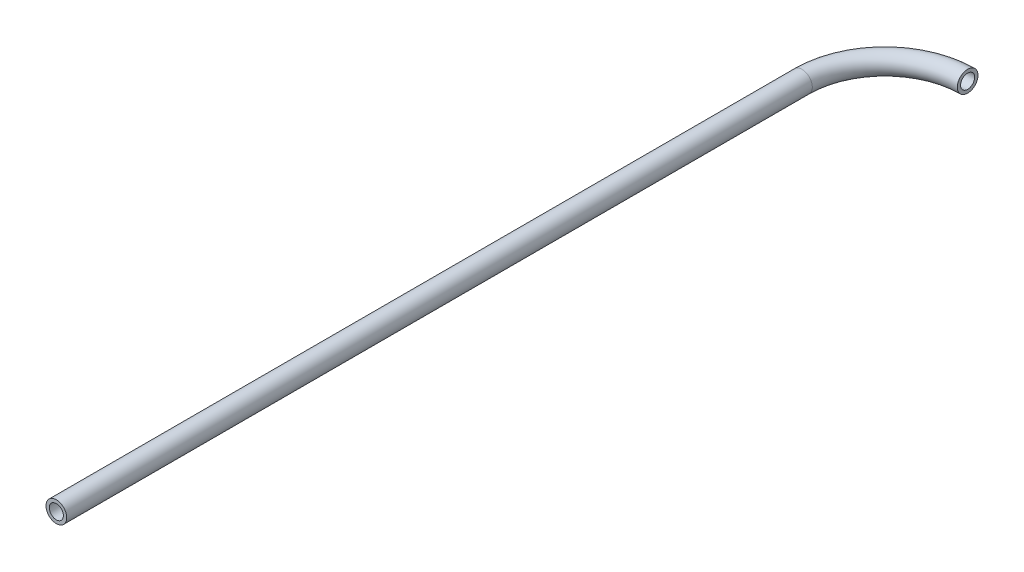
ISO-10303-21;
HEADER;
FILE_DESCRIPTION(('STEP AP214'),'2;1');
FILE_NAME('part.step','',(''),(''),'','','');
FILE_SCHEMA(('AUTOMOTIVE_DESIGN { 1 0 10303 214 1 1 1 1 }'));
ENDSEC;
DATA;
#1=APPLICATION_CONTEXT('core data for automotive mechanical design processes');
#2=APPLICATION_PROTOCOL_DEFINITION('international standard','automotive_design',2000,#1);
#3=PRODUCT_CONTEXT('',#1,'mechanical');
#4=PRODUCT('Part','Part','',(#3));
#5=PRODUCT_RELATED_PRODUCT_CATEGORY('part','',(#4));
#6=PRODUCT_DEFINITION_FORMATION('','',#4);
#7=PRODUCT_DEFINITION_CONTEXT('part definition',#1,'design');
#8=PRODUCT_DEFINITION('design','',#6,#7);
#9=PRODUCT_DEFINITION_SHAPE('','',#8);
#10=(LENGTH_UNIT() NAMED_UNIT(*) SI_UNIT(.MILLI.,.METRE.));
#11=(NAMED_UNIT(*) PLANE_ANGLE_UNIT() SI_UNIT($,.RADIAN.));
#12=(NAMED_UNIT(*) SI_UNIT($,.STERADIAN.) SOLID_ANGLE_UNIT());
#13=UNCERTAINTY_MEASURE_WITH_UNIT(LENGTH_MEASURE(1.E-05),#10,'distance_accuracy_value','');
#14=(GEOMETRIC_REPRESENTATION_CONTEXT(3) GLOBAL_UNCERTAINTY_ASSIGNED_CONTEXT((#13)) GLOBAL_UNIT_ASSIGNED_CONTEXT((#10,
#11,#12)) REPRESENTATION_CONTEXT('',''));
#15=CARTESIAN_POINT('',(0.,0.,0.));
#16=DIRECTION('',(0.,0.,1.));
#17=DIRECTION('',(1.,0.,0.));
#18=AXIS2_PLACEMENT_3D('',#15,#16,#17);
#19=CARTESIAN_POINT('',(-26.3429505447597,0.,-107.680105259806));
#20=DIRECTION('',(0.,-1.,0.));
#21=DIRECTION('',(0.,0.,-1.));
#22=AXIS2_PLACEMENT_3D('',#19,#20,#21);
#23=TOROIDAL_SURFACE('',#22,25.4,3.175);
#24=CARTESIAN_POINT('',(-51.7429505447597,0.,-107.680105259806));
#25=DIRECTION('',(0.,0.,1.));
#26=DIRECTION('',(1.,0.,0.));
#27=AXIS2_PLACEMENT_3D('',#24,#25,#26);
#28=CIRCLE('',#27,3.175);
#29=CARTESIAN_POINT('',(-54.9179505447597,0.,-107.680105259806));
#30=VERTEX_POINT('',#29);
#31=EDGE_CURVE('E41',#30,#30,#28,.T.);
#32=CARTESIAN_POINT('',(-26.3429505447596,0.,-133.080105259806));
#33=DIRECTION('',(-1.,0.,0.));
#34=DIRECTION('',(0.,0.,1.));
#35=AXIS2_PLACEMENT_3D('',#32,#33,#34);
#36=CIRCLE('',#35,3.175);
#37=CARTESIAN_POINT('',(-26.3429505447596,0.,-136.255105259806));
#38=VERTEX_POINT('',#37);
#39=EDGE_CURVE('E10',#38,#38,#36,.T.);
#40=CARTESIAN_POINT('',(-26.3429505447597,0.,-107.680105259806));
#41=DIRECTION('',(0.,-1.,0.));
#42=DIRECTION('',(0.,0.,-1.));
#43=AXIS2_PLACEMENT_3D('',#40,#41,#42);
#44=CIRCLE('',#43,28.575);
#45=EDGE_CURVE('',#30,#38,#44,.T.);
#46=ORIENTED_EDGE('',*,*,#31,.F.);
#47=ORIENTED_EDGE('',*,*,#39,.T.);
#48=ORIENTED_EDGE('',*,*,#45,.T.);
#49=ORIENTED_EDGE('',*,*,#45,.F.);
#50=EDGE_LOOP('',(#46,#48,#47,#49));
#51=FACE_BOUND('',#50,.T.);
#52=ADVANCED_FACE('F31',(#51),#23,.T.);
#53=CARTESIAN_POINT('',(-26.3429505447597,0.,-107.680105259806));
#54=DIRECTION('',(0.,-1.,0.));
#55=DIRECTION('',(0.,0.,-1.));
#56=AXIS2_PLACEMENT_3D('',#53,#54,#55);
#57=TOROIDAL_SURFACE('',#56,25.4,2.159);
#58=CARTESIAN_POINT('',(-51.7429505447597,0.,-107.680105259806));
#59=DIRECTION('',(0.,0.,1.));
#60=DIRECTION('',(1.,0.,0.));
#61=AXIS2_PLACEMENT_3D('',#58,#59,#60);
#62=CIRCLE('',#61,2.159);
#63=CARTESIAN_POINT('',(-53.9019505447597,0.,-107.680105259806));
#64=VERTEX_POINT('',#63);
#65=EDGE_CURVE('E45',#64,#64,#62,.T.);
#66=CARTESIAN_POINT('',(-26.3429505447596,0.,-133.080105259806));
#67=DIRECTION('',(-1.,0.,0.));
#68=DIRECTION('',(0.,0.,1.));
#69=AXIS2_PLACEMENT_3D('',#66,#67,#68);
#70=CIRCLE('',#69,2.159);
#71=CARTESIAN_POINT('',(-26.3429505447596,0.,-135.239105259806));
#72=VERTEX_POINT('',#71);
#73=EDGE_CURVE('E37',#72,#72,#70,.T.);
#74=CARTESIAN_POINT('',(-26.3429505447597,0.,-107.680105259806));
#75=DIRECTION('',(0.,-1.,0.));
#76=DIRECTION('',(0.,0.,-1.));
#77=AXIS2_PLACEMENT_3D('',#74,#75,#76);
#78=CIRCLE('',#77,27.559);
#79=EDGE_CURVE('',#64,#72,#78,.T.);
#80=ORIENTED_EDGE('',*,*,#65,.T.);
#81=ORIENTED_EDGE('',*,*,#73,.F.);
#82=ORIENTED_EDGE('',*,*,#79,.T.);
#83=ORIENTED_EDGE('',*,*,#79,.F.);
#84=EDGE_LOOP('',(#80,#82,#81,#83));
#85=FACE_BOUND('',#84,.T.);
#86=ADVANCED_FACE('F57',(#85),#57,.F.);
#87=CARTESIAN_POINT('',(-51.7429505447597,0.,-107.680105259806));
#88=DIRECTION('',(0.,0.,1.));
#89=DIRECTION('',(1.,0.,0.));
#90=AXIS2_PLACEMENT_3D('',#87,#88,#89);
#91=CYLINDRICAL_SURFACE('',#90,2.159);
#92=ORIENTED_EDGE('',*,*,#65,.F.);
#93=EDGE_LOOP('',(#92));
#94=FACE_BOUND('',#93,.T.);
#95=CARTESIAN_POINT('',(-51.7429505447596,0.,120.919894740194));
#96=DIRECTION('',(0.,0.,1.));
#97=DIRECTION('',(1.,0.,0.));
#98=AXIS2_PLACEMENT_3D('',#95,#96,#97);
#99=CIRCLE('',#98,2.159);
#100=CARTESIAN_POINT('',(-49.5839505447596,0.,120.919894740194));
#101=VERTEX_POINT('',#100);
#102=EDGE_CURVE('E51',#101,#101,#99,.T.);
#103=ORIENTED_EDGE('',*,*,#102,.T.);
#104=EDGE_LOOP('',(#103));
#105=FACE_BOUND('',#104,.T.);
#106=ADVANCED_FACE('F60',(#94,#105),#91,.F.);
#107=CARTESIAN_POINT('',(-51.7429505447597,0.,-107.680105259806));
#108=DIRECTION('',(0.,0.,1.));
#109=DIRECTION('',(1.,0.,0.));
#110=AXIS2_PLACEMENT_3D('',#107,#108,#109);
#111=CYLINDRICAL_SURFACE('',#110,3.175);
#112=ORIENTED_EDGE('',*,*,#31,.T.);
#113=EDGE_LOOP('',(#112));
#114=FACE_BOUND('',#113,.T.);
#115=CARTESIAN_POINT('',(-51.7429505447596,0.,120.919894740194));
#116=DIRECTION('',(0.,0.,1.));
#117=DIRECTION('',(1.,0.,0.));
#118=AXIS2_PLACEMENT_3D('',#115,#116,#117);
#119=CIRCLE('',#118,3.175);
#120=CARTESIAN_POINT('',(-48.5679505447596,0.,120.919894740194));
#121=VERTEX_POINT('',#120);
#122=EDGE_CURVE('E48',#121,#121,#119,.T.);
#123=ORIENTED_EDGE('',*,*,#122,.F.);
#124=EDGE_LOOP('',(#123));
#125=FACE_BOUND('',#124,.T.);
#126=ADVANCED_FACE('F63',(#114,#125),#111,.T.);
#127=CARTESIAN_POINT('',(-26.3429505447596,0.,-133.080105259806));
#128=DIRECTION('',(-1.,0.,0.));
#129=DIRECTION('',(0.,0.,1.));
#130=AXIS2_PLACEMENT_3D('',#127,#128,#129);
#131=PLANE('',#130);
#132=ORIENTED_EDGE('',*,*,#73,.T.);
#133=EDGE_LOOP('',(#132));
#134=FACE_BOUND('',#133,.T.);
#135=ORIENTED_EDGE('',*,*,#39,.F.);
#136=EDGE_LOOP('',(#135));
#137=FACE_BOUND('',#136,.T.);
#138=ADVANCED_FACE('F70',(#134,#137),#131,.F.);
#139=CARTESIAN_POINT('',(-51.7429505447596,0.,120.919894740194));
#140=DIRECTION('',(0.,0.,1.));
#141=DIRECTION('',(1.,0.,0.));
#142=AXIS2_PLACEMENT_3D('',#139,#140,#141);
#143=PLANE('',#142);
#144=ORIENTED_EDGE('',*,*,#102,.F.);
#145=EDGE_LOOP('',(#144));
#146=FACE_BOUND('',#145,.T.);
#147=ORIENTED_EDGE('',*,*,#122,.T.);
#148=EDGE_LOOP('',(#147));
#149=FACE_BOUND('',#148,.T.);
#150=ADVANCED_FACE('F67',(#146,#149),#143,.T.);
#151=CLOSED_SHELL('',(#52,#86,#106,#126,#138,#150));
#152=MANIFOLD_SOLID_BREP('B2',#151);
#153=ADVANCED_BREP_SHAPE_REPRESENTATION('',(#18,#152),#14);
#154=SHAPE_DEFINITION_REPRESENTATION(#9,#153);
ENDSEC;
END-ISO-10303-21;
